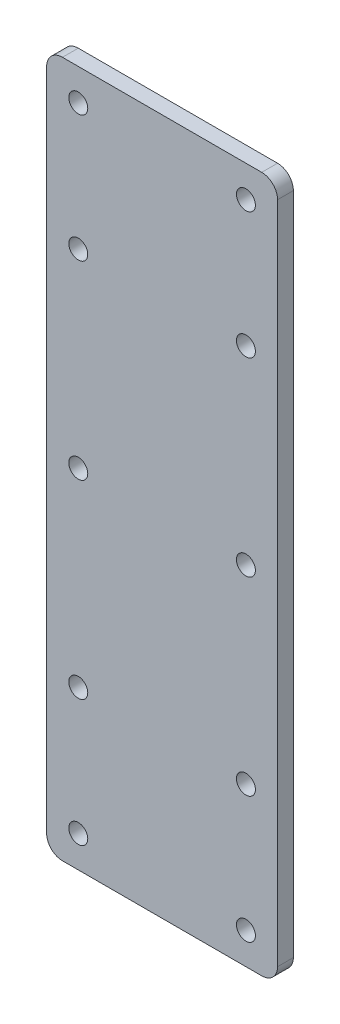
ISO-10303-21;
HEADER;
FILE_DESCRIPTION(('STEP AP214'),'2;1');
FILE_NAME('part.step','',(''),(''),'','','');
FILE_SCHEMA(('AUTOMOTIVE_DESIGN { 1 0 10303 214 1 1 1 1 }'));
ENDSEC;
DATA;
#1=APPLICATION_CONTEXT('core data for automotive mechanical design processes');
#2=APPLICATION_PROTOCOL_DEFINITION('international standard','automotive_design',2000,#1);
#3=PRODUCT_CONTEXT('',#1,'mechanical');
#4=PRODUCT('Part','Part','',(#3));
#5=PRODUCT_RELATED_PRODUCT_CATEGORY('part','',(#4));
#6=PRODUCT_DEFINITION_FORMATION('','',#4);
#7=PRODUCT_DEFINITION_CONTEXT('part definition',#1,'design');
#8=PRODUCT_DEFINITION('design','',#6,#7);
#9=PRODUCT_DEFINITION_SHAPE('','',#8);
#10=(LENGTH_UNIT() NAMED_UNIT(*) SI_UNIT(.MILLI.,.METRE.));
#11=(NAMED_UNIT(*) PLANE_ANGLE_UNIT() SI_UNIT($,.RADIAN.));
#12=(NAMED_UNIT(*) SI_UNIT($,.STERADIAN.) SOLID_ANGLE_UNIT());
#13=UNCERTAINTY_MEASURE_WITH_UNIT(LENGTH_MEASURE(1.E-05),#10,'distance_accuracy_value','');
#14=(GEOMETRIC_REPRESENTATION_CONTEXT(3) GLOBAL_UNCERTAINTY_ASSIGNED_CONTEXT((#13)) GLOBAL_UNIT_ASSIGNED_CONTEXT((#10,
#11,#12)) REPRESENTATION_CONTEXT('',''));
#15=CARTESIAN_POINT('',(0.,0.,0.));
#16=DIRECTION('',(0.,0.,1.));
#17=DIRECTION('',(1.,0.,0.));
#18=AXIS2_PLACEMENT_3D('',#15,#16,#17);
#19=CARTESIAN_POINT('',(4.99999999999988,215.,5.));
#20=DIRECTION('',(0.,0.,-1.));
#21=DIRECTION('',(-1.,0.,0.));
#22=AXIS2_PLACEMENT_3D('',#19,#20,#21);
#23=CYLINDRICAL_SURFACE('',#22,5.00000000000002);
#24=CARTESIAN_POINT('',(4.99999999999988,215.,0.));
#25=DIRECTION('',(0.,0.,1.));
#26=DIRECTION('',(1.,0.,0.));
#27=AXIS2_PLACEMENT_3D('',#24,#25,#26);
#28=CIRCLE('',#27,5.00000000000002);
#29=CARTESIAN_POINT('',(-1.11022302462516E-13,215.,0.));
#30=VERTEX_POINT('',#29);
#31=CARTESIAN_POINT('',(5.,220.,0.));
#32=VERTEX_POINT('',#31);
#33=EDGE_CURVE('E168',#30,#32,#28,.F.);
#34=ORIENTED_EDGE('',*,*,#33,.F.);
#35=DIRECTION('',(0.,0.,-1.));
#36=VECTOR('',#35,1.);
#37=CARTESIAN_POINT('',(-1.11022302462516E-13,215.,5.));
#38=LINE('',#37,#36);
#39=CARTESIAN_POINT('',(-1.11022302462516E-13,215.,5.));
#40=VERTEX_POINT('',#39);
#41=EDGE_CURVE('E11',#40,#30,#38,.T.);
#42=ORIENTED_EDGE('',*,*,#41,.F.);
#43=CARTESIAN_POINT('',(4.99999999999988,215.,5.));
#44=DIRECTION('',(0.,0.,1.));
#45=DIRECTION('',(1.,0.,0.));
#46=AXIS2_PLACEMENT_3D('',#43,#44,#45);
#47=CIRCLE('',#46,5.00000000000002);
#48=CARTESIAN_POINT('',(5.,220.,5.));
#49=VERTEX_POINT('',#48);
#50=EDGE_CURVE('E231',#40,#49,#47,.F.);
#51=ORIENTED_EDGE('',*,*,#50,.T.);
#52=DIRECTION('',(0.,0.,-1.));
#53=VECTOR('',#52,1.);
#54=CARTESIAN_POINT('',(5.,220.,5.));
#55=LINE('',#54,#53);
#56=EDGE_CURVE('E61',#49,#32,#55,.T.);
#57=ORIENTED_EDGE('',*,*,#56,.T.);
#58=EDGE_LOOP('',(#34,#42,#51,#57));
#59=FACE_BOUND('',#58,.T.);
#60=ADVANCED_FACE('F44',(#59),#23,.T.);
#61=CARTESIAN_POINT('',(0.,0.,5.));
#62=DIRECTION('',(-1.,0.,0.));
#63=DIRECTION('',(0.,-1.,0.));
#64=AXIS2_PLACEMENT_3D('',#61,#62,#63);
#65=PLANE('',#64);
#66=DIRECTION('',(0.,1.,0.));
#67=VECTOR('',#66,1.);
#68=CARTESIAN_POINT('',(0.,0.,0.));
#69=LINE('',#68,#67);
#70=CARTESIAN_POINT('',(0.,5.00000000000003,0.));
#71=VERTEX_POINT('',#70);
#72=EDGE_CURVE('E170',#71,#30,#69,.T.);
#73=ORIENTED_EDGE('',*,*,#72,.F.);
#74=DIRECTION('',(0.,0.,-1.));
#75=VECTOR('',#74,1.);
#76=CARTESIAN_POINT('',(0.,5.00000000000003,5.));
#77=LINE('',#76,#75);
#78=CARTESIAN_POINT('',(0.,5.00000000000003,5.));
#79=VERTEX_POINT('',#78);
#80=EDGE_CURVE('E53',#79,#71,#77,.T.);
#81=ORIENTED_EDGE('',*,*,#80,.F.);
#82=DIRECTION('',(0.,1.,0.));
#83=VECTOR('',#82,1.);
#84=CARTESIAN_POINT('',(0.,0.,5.));
#85=LINE('',#84,#83);
#86=EDGE_CURVE('E229',#79,#40,#85,.T.);
#87=ORIENTED_EDGE('',*,*,#86,.T.);
#88=ORIENTED_EDGE('',*,*,#41,.T.);
#89=EDGE_LOOP('',(#73,#81,#87,#88));
#90=FACE_BOUND('',#89,.T.);
#91=ADVANCED_FACE('F218',(#90),#65,.T.);
#92=CARTESIAN_POINT('',(5.,5.,5.));
#93=DIRECTION('',(0.,0.,-1.));
#94=DIRECTION('',(-1.,0.,0.));
#95=AXIS2_PLACEMENT_3D('',#92,#93,#94);
#96=CYLINDRICAL_SURFACE('',#95,5.);
#97=CARTESIAN_POINT('',(5.,5.,0.));
#98=DIRECTION('',(0.,0.,1.));
#99=DIRECTION('',(1.,0.,0.));
#100=AXIS2_PLACEMENT_3D('',#97,#98,#99);
#101=CIRCLE('',#100,5.);
#102=CARTESIAN_POINT('',(5.00000000000003,0.,0.));
#103=VERTEX_POINT('',#102);
#104=EDGE_CURVE('E173',#103,#71,#101,.F.);
#105=ORIENTED_EDGE('',*,*,#104,.F.);
#106=DIRECTION('',(0.,0.,-1.));
#107=VECTOR('',#106,1.);
#108=CARTESIAN_POINT('',(5.00000000000003,0.,5.));
#109=LINE('',#108,#107);
#110=CARTESIAN_POINT('',(5.00000000000003,0.,5.));
#111=VERTEX_POINT('',#110);
#112=EDGE_CURVE('E207',#111,#103,#109,.T.);
#113=ORIENTED_EDGE('',*,*,#112,.F.);
#114=CARTESIAN_POINT('',(5.,5.,5.));
#115=DIRECTION('',(0.,0.,1.));
#116=DIRECTION('',(1.,0.,0.));
#117=AXIS2_PLACEMENT_3D('',#114,#115,#116);
#118=CIRCLE('',#117,5.);
#119=EDGE_CURVE('E214',#111,#79,#118,.F.);
#120=ORIENTED_EDGE('',*,*,#119,.T.);
#121=ORIENTED_EDGE('',*,*,#80,.T.);
#122=EDGE_LOOP('',(#105,#113,#120,#121));
#123=FACE_BOUND('',#122,.T.);
#124=ADVANCED_FACE('F212',(#123),#96,.T.);
#125=CARTESIAN_POINT('',(0.,0.,5.));
#126=DIRECTION('',(0.,1.,0.));
#127=DIRECTION('',(-1.,0.,0.));
#128=AXIS2_PLACEMENT_3D('',#125,#126,#127);
#129=PLANE('',#128);
#130=DIRECTION('',(1.,0.,0.));
#131=VECTOR('',#130,1.);
#132=CARTESIAN_POINT('',(0.,0.,0.));
#133=LINE('',#132,#131);
#134=CARTESIAN_POINT('',(68.,0.,0.));
#135=VERTEX_POINT('',#134);
#136=EDGE_CURVE('E176',#103,#135,#133,.T.);
#137=ORIENTED_EDGE('',*,*,#136,.T.);
#138=DIRECTION('',(0.,0.,-1.));
#139=VECTOR('',#138,1.);
#140=CARTESIAN_POINT('',(68.,0.,5.));
#141=LINE('',#140,#139);
#142=CARTESIAN_POINT('',(68.,0.,5.));
#143=VERTEX_POINT('',#142);
#144=EDGE_CURVE('E204',#143,#135,#141,.T.);
#145=ORIENTED_EDGE('',*,*,#144,.F.);
#146=DIRECTION('',(1.,0.,0.));
#147=VECTOR('',#146,1.);
#148=CARTESIAN_POINT('',(0.,0.,5.));
#149=LINE('',#148,#147);
#150=EDGE_CURVE('E227',#111,#143,#149,.T.);
#151=ORIENTED_EDGE('',*,*,#150,.F.);
#152=ORIENTED_EDGE('',*,*,#112,.T.);
#153=EDGE_LOOP('',(#137,#145,#151,#152));
#154=FACE_BOUND('',#153,.T.);
#155=ADVANCED_FACE('F225',(#154),#129,.F.);
#156=CARTESIAN_POINT('',(68.,5.,5.));
#157=DIRECTION('',(0.,0.,-1.));
#158=DIRECTION('',(-1.,0.,0.));
#159=AXIS2_PLACEMENT_3D('',#156,#157,#158);
#160=CYLINDRICAL_SURFACE('',#159,5.);
#161=CARTESIAN_POINT('',(68.,5.,0.));
#162=DIRECTION('',(0.,0.,1.));
#163=DIRECTION('',(1.,0.,0.));
#164=AXIS2_PLACEMENT_3D('',#161,#162,#163);
#165=CIRCLE('',#164,5.);
#166=CARTESIAN_POINT('',(73.,5.00000000000004,0.));
#167=VERTEX_POINT('',#166);
#168=EDGE_CURVE('E179',#135,#167,#165,.T.);
#169=ORIENTED_EDGE('',*,*,#168,.T.);
#170=DIRECTION('',(0.,0.,-1.));
#171=VECTOR('',#170,1.);
#172=CARTESIAN_POINT('',(73.,5.00000000000004,5.));
#173=LINE('',#172,#171);
#174=CARTESIAN_POINT('',(73.,5.00000000000004,5.));
#175=VERTEX_POINT('',#174);
#176=EDGE_CURVE('E130',#175,#167,#173,.T.);
#177=ORIENTED_EDGE('',*,*,#176,.F.);
#178=CARTESIAN_POINT('',(68.,5.,5.));
#179=DIRECTION('',(0.,0.,1.));
#180=DIRECTION('',(1.,0.,0.));
#181=AXIS2_PLACEMENT_3D('',#178,#179,#180);
#182=CIRCLE('',#181,5.);
#183=EDGE_CURVE('E119',#143,#175,#182,.T.);
#184=ORIENTED_EDGE('',*,*,#183,.F.);
#185=ORIENTED_EDGE('',*,*,#144,.T.);
#186=EDGE_LOOP('',(#169,#177,#184,#185));
#187=FACE_BOUND('',#186,.T.);
#188=ADVANCED_FACE('F345',(#187),#160,.T.);
#189=CARTESIAN_POINT('',(73.,0.,5.));
#190=DIRECTION('',(-1.,0.,0.));
#191=DIRECTION('',(0.,-1.,0.));
#192=AXIS2_PLACEMENT_3D('',#189,#190,#191);
#193=PLANE('',#192);
#194=DIRECTION('',(0.,1.,0.));
#195=VECTOR('',#194,1.);
#196=CARTESIAN_POINT('',(73.,0.,0.));
#197=LINE('',#196,#195);
#198=CARTESIAN_POINT('',(73.,215.,0.));
#199=VERTEX_POINT('',#198);
#200=EDGE_CURVE('E127',#167,#199,#197,.T.);
#201=ORIENTED_EDGE('',*,*,#200,.T.);
#202=DIRECTION('',(0.,0.,-1.));
#203=VECTOR('',#202,1.);
#204=CARTESIAN_POINT('',(73.,215.,5.));
#205=LINE('',#204,#203);
#206=CARTESIAN_POINT('',(73.,215.,5.));
#207=VERTEX_POINT('',#206);
#208=EDGE_CURVE('E125',#207,#199,#205,.T.);
#209=ORIENTED_EDGE('',*,*,#208,.F.);
#210=DIRECTION('',(0.,1.,0.));
#211=VECTOR('',#210,1.);
#212=CARTESIAN_POINT('',(73.,0.,5.));
#213=LINE('',#212,#211);
#214=EDGE_CURVE('E111',#175,#207,#213,.T.);
#215=ORIENTED_EDGE('',*,*,#214,.F.);
#216=ORIENTED_EDGE('',*,*,#176,.T.);
#217=EDGE_LOOP('',(#201,#209,#215,#216));
#218=FACE_BOUND('',#217,.T.);
#219=ADVANCED_FACE('F126',(#218),#193,.F.);
#220=CARTESIAN_POINT('',(68.,215.,5.));
#221=DIRECTION('',(0.,0.,-1.));
#222=DIRECTION('',(-1.,0.,0.));
#223=AXIS2_PLACEMENT_3D('',#220,#221,#222);
#224=CYLINDRICAL_SURFACE('',#223,5.00000000000002);
#225=CARTESIAN_POINT('',(68.,215.,0.));
#226=DIRECTION('',(0.,0.,1.));
#227=DIRECTION('',(1.,0.,0.));
#228=AXIS2_PLACEMENT_3D('',#225,#226,#227);
#229=CIRCLE('',#228,5.00000000000002);
#230=CARTESIAN_POINT('',(67.9999999999999,220.,0.));
#231=VERTEX_POINT('',#230);
#232=EDGE_CURVE('E183',#231,#199,#229,.F.);
#233=ORIENTED_EDGE('',*,*,#232,.F.);
#234=DIRECTION('',(0.,0.,-1.));
#235=VECTOR('',#234,1.);
#236=CARTESIAN_POINT('',(67.9999999999999,220.,5.));
#237=LINE('',#236,#235);
#238=CARTESIAN_POINT('',(67.9999999999999,220.,5.));
#239=VERTEX_POINT('',#238);
#240=EDGE_CURVE('E86',#239,#231,#237,.T.);
#241=ORIENTED_EDGE('',*,*,#240,.F.);
#242=CARTESIAN_POINT('',(68.,215.,5.));
#243=DIRECTION('',(0.,0.,1.));
#244=DIRECTION('',(1.,0.,0.));
#245=AXIS2_PLACEMENT_3D('',#242,#243,#244);
#246=CIRCLE('',#245,5.00000000000002);
#247=EDGE_CURVE('E117',#239,#207,#246,.F.);
#248=ORIENTED_EDGE('',*,*,#247,.T.);
#249=ORIENTED_EDGE('',*,*,#208,.T.);
#250=EDGE_LOOP('',(#233,#241,#248,#249));
#251=FACE_BOUND('',#250,.T.);
#252=ADVANCED_FACE('F132',(#251),#224,.T.);
#253=CARTESIAN_POINT('',(9.99999999999999,50.,5.));
#254=DIRECTION('',(0.,0.,-1.));
#255=DIRECTION('',(-1.,0.,0.));
#256=AXIS2_PLACEMENT_3D('',#253,#254,#255);
#257=CYLINDRICAL_SURFACE('',#256,3.);
#258=CARTESIAN_POINT('',(9.99999999999999,50.,5.));
#259=DIRECTION('',(0.,0.,1.));
#260=DIRECTION('',(1.,0.,0.));
#261=AXIS2_PLACEMENT_3D('',#258,#259,#260);
#262=CIRCLE('',#261,3.);
#263=CARTESIAN_POINT('',(13.,50.,5.));
#264=VERTEX_POINT('',#263);
#265=EDGE_CURVE('E144',#264,#264,#262,.T.);
#266=ORIENTED_EDGE('',*,*,#265,.T.);
#267=EDGE_LOOP('',(#266));
#268=FACE_BOUND('',#267,.T.);
#269=CARTESIAN_POINT('',(9.99999999999999,50.,0.));
#270=DIRECTION('',(0.,0.,1.));
#271=DIRECTION('',(1.,0.,0.));
#272=AXIS2_PLACEMENT_3D('',#269,#270,#271);
#273=CIRCLE('',#272,3.);
#274=CARTESIAN_POINT('',(13.,50.,0.));
#275=VERTEX_POINT('',#274);
#276=EDGE_CURVE('E194',#275,#275,#273,.T.);
#277=ORIENTED_EDGE('',*,*,#276,.F.);
#278=EDGE_LOOP('',(#277));
#279=FACE_BOUND('',#278,.T.);
#280=ADVANCED_FACE('F327',(#268,#279),#257,.F.);
#281=CARTESIAN_POINT('',(9.99999999999998,110.,5.));
#282=DIRECTION('',(0.,0.,-1.));
#283=DIRECTION('',(-1.,0.,0.));
#284=AXIS2_PLACEMENT_3D('',#281,#282,#283);
#285=CYLINDRICAL_SURFACE('',#284,3.);
#286=CARTESIAN_POINT('',(9.99999999999998,110.,5.));
#287=DIRECTION('',(0.,0.,1.));
#288=DIRECTION('',(1.,0.,0.));
#289=AXIS2_PLACEMENT_3D('',#286,#287,#288);
#290=CIRCLE('',#289,3.);
#291=CARTESIAN_POINT('',(13.,110.,5.));
#292=VERTEX_POINT('',#291);
#293=EDGE_CURVE('E141',#292,#292,#290,.T.);
#294=ORIENTED_EDGE('',*,*,#293,.T.);
#295=EDGE_LOOP('',(#294));
#296=FACE_BOUND('',#295,.T.);
#297=CARTESIAN_POINT('',(9.99999999999998,110.,0.));
#298=DIRECTION('',(0.,0.,1.));
#299=DIRECTION('',(1.,0.,0.));
#300=AXIS2_PLACEMENT_3D('',#297,#298,#299);
#301=CIRCLE('',#300,3.);
#302=CARTESIAN_POINT('',(13.,110.,0.));
#303=VERTEX_POINT('',#302);
#304=EDGE_CURVE('E191',#303,#303,#301,.T.);
#305=ORIENTED_EDGE('',*,*,#304,.F.);
#306=EDGE_LOOP('',(#305));
#307=FACE_BOUND('',#306,.T.);
#308=ADVANCED_FACE('F330',(#296,#307),#285,.F.);
#309=CARTESIAN_POINT('',(63.,110.,5.));
#310=DIRECTION('',(0.,0.,-1.));
#311=DIRECTION('',(-1.,0.,0.));
#312=AXIS2_PLACEMENT_3D('',#309,#310,#311);
#313=CYLINDRICAL_SURFACE('',#312,3.00000000000001);
#314=CARTESIAN_POINT('',(63.,110.,5.));
#315=DIRECTION('',(0.,0.,1.));
#316=DIRECTION('',(1.,0.,0.));
#317=AXIS2_PLACEMENT_3D('',#314,#315,#316);
#318=CIRCLE('',#317,3.00000000000001);
#319=CARTESIAN_POINT('',(66.,110.,5.));
#320=VERTEX_POINT('',#319);
#321=EDGE_CURVE('E135',#320,#320,#318,.T.);
#322=ORIENTED_EDGE('',*,*,#321,.T.);
#323=EDGE_LOOP('',(#322));
#324=FACE_BOUND('',#323,.T.);
#325=CARTESIAN_POINT('',(63.,110.,0.));
#326=DIRECTION('',(0.,0.,1.));
#327=DIRECTION('',(1.,0.,0.));
#328=AXIS2_PLACEMENT_3D('',#325,#326,#327);
#329=CIRCLE('',#328,3.00000000000001);
#330=CARTESIAN_POINT('',(66.,110.,0.));
#331=VERTEX_POINT('',#330);
#332=EDGE_CURVE('E188',#331,#331,#329,.T.);
#333=ORIENTED_EDGE('',*,*,#332,.F.);
#334=EDGE_LOOP('',(#333));
#335=FACE_BOUND('',#334,.T.);
#336=ADVANCED_FACE('F334',(#324,#335),#313,.F.);
#337=CARTESIAN_POINT('',(0.,220.,5.));
#338=DIRECTION('',(0.,1.,0.));
#339=DIRECTION('',(-1.,0.,0.));
#340=AXIS2_PLACEMENT_3D('',#337,#338,#339);
#341=PLANE('',#340);
#342=DIRECTION('',(1.,0.,0.));
#343=VECTOR('',#342,1.);
#344=CARTESIAN_POINT('',(0.,220.,0.));
#345=LINE('',#344,#343);
#346=EDGE_CURVE('E185',#32,#231,#345,.T.);
#347=ORIENTED_EDGE('',*,*,#346,.F.);
#348=ORIENTED_EDGE('',*,*,#56,.F.);
#349=DIRECTION('',(1.,0.,0.));
#350=VECTOR('',#349,1.);
#351=CARTESIAN_POINT('',(0.,220.,5.));
#352=LINE('',#351,#350);
#353=EDGE_CURVE('E133',#49,#239,#352,.T.);
#354=ORIENTED_EDGE('',*,*,#353,.T.);
#355=ORIENTED_EDGE('',*,*,#240,.T.);
#356=EDGE_LOOP('',(#347,#348,#354,#355));
#357=FACE_BOUND('',#356,.T.);
#358=ADVANCED_FACE('F273',(#357),#341,.T.);
#359=CARTESIAN_POINT('',(63.,170.,5.));
#360=DIRECTION('',(0.,0.,-1.));
#361=DIRECTION('',(-1.,0.,0.));
#362=AXIS2_PLACEMENT_3D('',#359,#360,#361);
#363=CYLINDRICAL_SURFACE('',#362,3.00000000000001);
#364=CARTESIAN_POINT('',(63.,170.,5.));
#365=DIRECTION('',(0.,0.,1.));
#366=DIRECTION('',(1.,0.,0.));
#367=AXIS2_PLACEMENT_3D('',#364,#365,#366);
#368=CIRCLE('',#367,3.00000000000001);
#369=CARTESIAN_POINT('',(66.,170.,5.));
#370=VERTEX_POINT('',#369);
#371=EDGE_CURVE('E235',#370,#370,#368,.T.);
#372=ORIENTED_EDGE('',*,*,#371,.T.);
#373=EDGE_LOOP('',(#372));
#374=FACE_BOUND('',#373,.T.);
#375=CARTESIAN_POINT('',(63.,170.,0.));
#376=DIRECTION('',(0.,0.,1.));
#377=DIRECTION('',(1.,0.,0.));
#378=AXIS2_PLACEMENT_3D('',#375,#376,#377);
#379=CIRCLE('',#378,3.00000000000001);
#380=CARTESIAN_POINT('',(66.,170.,0.));
#381=VERTEX_POINT('',#380);
#382=EDGE_CURVE('E165',#381,#381,#379,.T.);
#383=ORIENTED_EDGE('',*,*,#382,.F.);
#384=EDGE_LOOP('',(#383));
#385=FACE_BOUND('',#384,.T.);
#386=ADVANCED_FACE('F269',(#374,#385),#363,.F.);
#387=CARTESIAN_POINT('',(62.9999999999999,210.,5.));
#388=DIRECTION('',(0.,0.,-1.));
#389=DIRECTION('',(-1.,0.,0.));
#390=AXIS2_PLACEMENT_3D('',#387,#388,#389);
#391=CYLINDRICAL_SURFACE('',#390,3.00000000000001);
#392=CARTESIAN_POINT('',(62.9999999999999,210.,5.));
#393=DIRECTION('',(0.,0.,1.));
#394=DIRECTION('',(1.,0.,0.));
#395=AXIS2_PLACEMENT_3D('',#392,#393,#394);
#396=CIRCLE('',#395,3.00000000000001);
#397=CARTESIAN_POINT('',(65.9999999999999,210.,5.));
#398=VERTEX_POINT('',#397);
#399=EDGE_CURVE('E238',#398,#398,#396,.T.);
#400=ORIENTED_EDGE('',*,*,#399,.T.);
#401=EDGE_LOOP('',(#400));
#402=FACE_BOUND('',#401,.T.);
#403=CARTESIAN_POINT('',(62.9999999999999,210.,0.));
#404=DIRECTION('',(0.,0.,1.));
#405=DIRECTION('',(1.,0.,0.));
#406=AXIS2_PLACEMENT_3D('',#403,#404,#405);
#407=CIRCLE('',#406,3.00000000000001);
#408=CARTESIAN_POINT('',(65.9999999999999,210.,0.));
#409=VERTEX_POINT('',#408);
#410=EDGE_CURVE('E162',#409,#409,#407,.T.);
#411=ORIENTED_EDGE('',*,*,#410,.F.);
#412=EDGE_LOOP('',(#411));
#413=FACE_BOUND('',#412,.T.);
#414=ADVANCED_FACE('F272',(#402,#413),#391,.F.);
#415=CARTESIAN_POINT('',(9.99999999999996,170.,5.));
#416=DIRECTION('',(0.,0.,-1.));
#417=DIRECTION('',(-1.,0.,0.));
#418=AXIS2_PLACEMENT_3D('',#415,#416,#417);
#419=CYLINDRICAL_SURFACE('',#418,3.);
#420=CARTESIAN_POINT('',(9.99999999999996,170.,5.));
#421=DIRECTION('',(0.,0.,1.));
#422=DIRECTION('',(1.,0.,0.));
#423=AXIS2_PLACEMENT_3D('',#420,#421,#422);
#424=CIRCLE('',#423,3.);
#425=CARTESIAN_POINT('',(13.,170.,5.));
#426=VERTEX_POINT('',#425);
#427=EDGE_CURVE('E241',#426,#426,#424,.T.);
#428=ORIENTED_EDGE('',*,*,#427,.T.);
#429=EDGE_LOOP('',(#428));
#430=FACE_BOUND('',#429,.T.);
#431=CARTESIAN_POINT('',(9.99999999999996,170.,0.));
#432=DIRECTION('',(0.,0.,1.));
#433=DIRECTION('',(1.,0.,0.));
#434=AXIS2_PLACEMENT_3D('',#431,#432,#433);
#435=CIRCLE('',#434,3.);
#436=CARTESIAN_POINT('',(13.,170.,0.));
#437=VERTEX_POINT('',#436);
#438=EDGE_CURVE('E159',#437,#437,#435,.T.);
#439=ORIENTED_EDGE('',*,*,#438,.F.);
#440=EDGE_LOOP('',(#439));
#441=FACE_BOUND('',#440,.T.);
#442=ADVANCED_FACE('F294',(#430,#441),#419,.F.);
#443=CARTESIAN_POINT('',(63.,50.,5.));
#444=DIRECTION('',(0.,0.,-1.));
#445=DIRECTION('',(-1.,0.,0.));
#446=AXIS2_PLACEMENT_3D('',#443,#444,#445);
#447=CYLINDRICAL_SURFACE('',#446,3.00000000000001);
#448=CARTESIAN_POINT('',(63.,50.,5.));
#449=DIRECTION('',(0.,0.,1.));
#450=DIRECTION('',(1.,0.,0.));
#451=AXIS2_PLACEMENT_3D('',#448,#449,#450);
#452=CIRCLE('',#451,3.00000000000001);
#453=CARTESIAN_POINT('',(66.,50.,5.));
#454=VERTEX_POINT('',#453);
#455=EDGE_CURVE('E244',#454,#454,#452,.T.);
#456=ORIENTED_EDGE('',*,*,#455,.T.);
#457=EDGE_LOOP('',(#456));
#458=FACE_BOUND('',#457,.T.);
#459=CARTESIAN_POINT('',(63.,50.,0.));
#460=DIRECTION('',(0.,0.,1.));
#461=DIRECTION('',(1.,0.,0.));
#462=AXIS2_PLACEMENT_3D('',#459,#460,#461);
#463=CIRCLE('',#462,3.00000000000001);
#464=CARTESIAN_POINT('',(66.,50.,0.));
#465=VERTEX_POINT('',#464);
#466=EDGE_CURVE('E156',#465,#465,#463,.T.);
#467=ORIENTED_EDGE('',*,*,#466,.F.);
#468=EDGE_LOOP('',(#467));
#469=FACE_BOUND('',#468,.T.);
#470=ADVANCED_FACE('F298',(#458,#469),#447,.F.);
#471=CARTESIAN_POINT('',(9.99999999999999,10.,5.));
#472=DIRECTION('',(0.,0.,-1.));
#473=DIRECTION('',(-1.,0.,0.));
#474=AXIS2_PLACEMENT_3D('',#471,#472,#473);
#475=CYLINDRICAL_SURFACE('',#474,3.);
#476=CARTESIAN_POINT('',(9.99999999999999,10.,5.));
#477=DIRECTION('',(0.,0.,1.));
#478=DIRECTION('',(1.,0.,0.));
#479=AXIS2_PLACEMENT_3D('',#476,#477,#478);
#480=CIRCLE('',#479,3.);
#481=CARTESIAN_POINT('',(13.,10.,5.));
#482=VERTEX_POINT('',#481);
#483=EDGE_CURVE('E247',#482,#482,#480,.T.);
#484=ORIENTED_EDGE('',*,*,#483,.T.);
#485=EDGE_LOOP('',(#484));
#486=FACE_BOUND('',#485,.T.);
#487=CARTESIAN_POINT('',(9.99999999999999,10.,0.));
#488=DIRECTION('',(0.,0.,1.));
#489=DIRECTION('',(1.,0.,0.));
#490=AXIS2_PLACEMENT_3D('',#487,#488,#489);
#491=CIRCLE('',#490,3.);
#492=CARTESIAN_POINT('',(13.,10.,0.));
#493=VERTEX_POINT('',#492);
#494=EDGE_CURVE('E153',#493,#493,#491,.T.);
#495=ORIENTED_EDGE('',*,*,#494,.F.);
#496=EDGE_LOOP('',(#495));
#497=FACE_BOUND('',#496,.T.);
#498=ADVANCED_FACE('F301',(#486,#497),#475,.F.);
#499=CARTESIAN_POINT('',(63.,10.,5.));
#500=DIRECTION('',(0.,0.,-1.));
#501=DIRECTION('',(-1.,0.,0.));
#502=AXIS2_PLACEMENT_3D('',#499,#500,#501);
#503=CYLINDRICAL_SURFACE('',#502,3.00000000000001);
#504=CARTESIAN_POINT('',(63.,10.,5.));
#505=DIRECTION('',(0.,0.,1.));
#506=DIRECTION('',(1.,0.,0.));
#507=AXIS2_PLACEMENT_3D('',#504,#505,#506);
#508=CIRCLE('',#507,3.00000000000001);
#509=CARTESIAN_POINT('',(66.,10.,5.));
#510=VERTEX_POINT('',#509);
#511=EDGE_CURVE('E200',#510,#510,#508,.T.);
#512=ORIENTED_EDGE('',*,*,#511,.T.);
#513=EDGE_LOOP('',(#512));
#514=FACE_BOUND('',#513,.T.);
#515=CARTESIAN_POINT('',(63.,10.,0.));
#516=DIRECTION('',(0.,0.,1.));
#517=DIRECTION('',(1.,0.,0.));
#518=AXIS2_PLACEMENT_3D('',#515,#516,#517);
#519=CIRCLE('',#518,3.00000000000001);
#520=CARTESIAN_POINT('',(66.,10.,0.));
#521=VERTEX_POINT('',#520);
#522=EDGE_CURVE('E150',#521,#521,#519,.T.);
#523=ORIENTED_EDGE('',*,*,#522,.F.);
#524=EDGE_LOOP('',(#523));
#525=FACE_BOUND('',#524,.T.);
#526=ADVANCED_FACE('F46',(#514,#525),#503,.F.);
#527=CARTESIAN_POINT('',(9.99999999999996,210.,5.));
#528=DIRECTION('',(0.,0.,-1.));
#529=DIRECTION('',(-1.,0.,0.));
#530=AXIS2_PLACEMENT_3D('',#527,#528,#529);
#531=CYLINDRICAL_SURFACE('',#530,3.);
#532=CARTESIAN_POINT('',(9.99999999999996,210.,5.));
#533=DIRECTION('',(0.,0.,1.));
#534=DIRECTION('',(1.,0.,0.));
#535=AXIS2_PLACEMENT_3D('',#532,#533,#534);
#536=CIRCLE('',#535,3.);
#537=CARTESIAN_POINT('',(13.,210.,5.));
#538=VERTEX_POINT('',#537);
#539=EDGE_CURVE('E147',#538,#538,#536,.T.);
#540=ORIENTED_EDGE('',*,*,#539,.T.);
#541=EDGE_LOOP('',(#540));
#542=FACE_BOUND('',#541,.T.);
#543=CARTESIAN_POINT('',(9.99999999999996,210.,0.));
#544=DIRECTION('',(0.,0.,1.));
#545=DIRECTION('',(1.,0.,0.));
#546=AXIS2_PLACEMENT_3D('',#543,#544,#545);
#547=CIRCLE('',#546,3.);
#548=CARTESIAN_POINT('',(13.,210.,0.));
#549=VERTEX_POINT('',#548);
#550=EDGE_CURVE('E197',#549,#549,#547,.T.);
#551=ORIENTED_EDGE('',*,*,#550,.F.);
#552=EDGE_LOOP('',(#551));
#553=FACE_BOUND('',#552,.T.);
#554=ADVANCED_FACE('F257',(#542,#553),#531,.F.);
#555=CARTESIAN_POINT('',(0.,0.,5.));
#556=DIRECTION('',(0.,0.,1.));
#557=DIRECTION('',(1.,0.,0.));
#558=AXIS2_PLACEMENT_3D('',#555,#556,#557);
#559=PLANE('',#558);
#560=ORIENTED_EDGE('',*,*,#511,.F.);
#561=EDGE_LOOP('',(#560));
#562=FACE_BOUND('',#561,.T.);
#563=ORIENTED_EDGE('',*,*,#483,.F.);
#564=EDGE_LOOP('',(#563));
#565=FACE_BOUND('',#564,.T.);
#566=ORIENTED_EDGE('',*,*,#455,.F.);
#567=EDGE_LOOP('',(#566));
#568=FACE_BOUND('',#567,.T.);
#569=ORIENTED_EDGE('',*,*,#427,.F.);
#570=EDGE_LOOP('',(#569));
#571=FACE_BOUND('',#570,.T.);
#572=ORIENTED_EDGE('',*,*,#399,.F.);
#573=EDGE_LOOP('',(#572));
#574=FACE_BOUND('',#573,.T.);
#575=ORIENTED_EDGE('',*,*,#371,.F.);
#576=EDGE_LOOP('',(#575));
#577=FACE_BOUND('',#576,.T.);
#578=ORIENTED_EDGE('',*,*,#50,.F.);
#579=ORIENTED_EDGE('',*,*,#86,.F.);
#580=ORIENTED_EDGE('',*,*,#119,.F.);
#581=ORIENTED_EDGE('',*,*,#150,.T.);
#582=ORIENTED_EDGE('',*,*,#183,.T.);
#583=ORIENTED_EDGE('',*,*,#214,.T.);
#584=ORIENTED_EDGE('',*,*,#247,.F.);
#585=ORIENTED_EDGE('',*,*,#353,.F.);
#586=EDGE_LOOP('',(#578,#579,#580,#581,#582,#583,#584,#585));
#587=FACE_BOUND('',#586,.T.);
#588=ORIENTED_EDGE('',*,*,#321,.F.);
#589=EDGE_LOOP('',(#588));
#590=FACE_BOUND('',#589,.T.);
#591=ORIENTED_EDGE('',*,*,#293,.F.);
#592=EDGE_LOOP('',(#591));
#593=FACE_BOUND('',#592,.T.);
#594=ORIENTED_EDGE('',*,*,#265,.F.);
#595=EDGE_LOOP('',(#594));
#596=FACE_BOUND('',#595,.T.);
#597=ORIENTED_EDGE('',*,*,#539,.F.);
#598=EDGE_LOOP('',(#597));
#599=FACE_BOUND('',#598,.T.);
#600=ADVANCED_FACE('F113',(#562,#565,#568,#571,#574,#577,#587,#590,#593,#596,#599),#559,.T.);
#601=CARTESIAN_POINT('',(0.,0.,0.));
#602=DIRECTION('',(0.,0.,1.));
#603=DIRECTION('',(1.,0.,0.));
#604=AXIS2_PLACEMENT_3D('',#601,#602,#603);
#605=PLANE('',#604);
#606=ORIENTED_EDGE('',*,*,#522,.T.);
#607=EDGE_LOOP('',(#606));
#608=FACE_BOUND('',#607,.T.);
#609=ORIENTED_EDGE('',*,*,#494,.T.);
#610=EDGE_LOOP('',(#609));
#611=FACE_BOUND('',#610,.T.);
#612=ORIENTED_EDGE('',*,*,#466,.T.);
#613=EDGE_LOOP('',(#612));
#614=FACE_BOUND('',#613,.T.);
#615=ORIENTED_EDGE('',*,*,#438,.T.);
#616=EDGE_LOOP('',(#615));
#617=FACE_BOUND('',#616,.T.);
#618=ORIENTED_EDGE('',*,*,#410,.T.);
#619=EDGE_LOOP('',(#618));
#620=FACE_BOUND('',#619,.T.);
#621=ORIENTED_EDGE('',*,*,#382,.T.);
#622=EDGE_LOOP('',(#621));
#623=FACE_BOUND('',#622,.T.);
#624=ORIENTED_EDGE('',*,*,#33,.T.);
#625=ORIENTED_EDGE('',*,*,#346,.T.);
#626=ORIENTED_EDGE('',*,*,#232,.T.);
#627=ORIENTED_EDGE('',*,*,#200,.F.);
#628=ORIENTED_EDGE('',*,*,#168,.F.);
#629=ORIENTED_EDGE('',*,*,#136,.F.);
#630=ORIENTED_EDGE('',*,*,#104,.T.);
#631=ORIENTED_EDGE('',*,*,#72,.T.);
#632=EDGE_LOOP('',(#624,#625,#626,#627,#628,#629,#630,#631));
#633=FACE_BOUND('',#632,.T.);
#634=ORIENTED_EDGE('',*,*,#332,.T.);
#635=EDGE_LOOP('',(#634));
#636=FACE_BOUND('',#635,.T.);
#637=ORIENTED_EDGE('',*,*,#304,.T.);
#638=EDGE_LOOP('',(#637));
#639=FACE_BOUND('',#638,.T.);
#640=ORIENTED_EDGE('',*,*,#276,.T.);
#641=EDGE_LOOP('',(#640));
#642=FACE_BOUND('',#641,.T.);
#643=ORIENTED_EDGE('',*,*,#550,.T.);
#644=EDGE_LOOP('',(#643));
#645=FACE_BOUND('',#644,.T.);
#646=ADVANCED_FACE('F221',(#608,#611,#614,#617,#620,#623,#633,#636,#639,#642,#645),#605,.F.);
#647=CLOSED_SHELL('',(#60,#91,#124,#155,#188,#219,#252,#280,#308,#336,#358,#386,#414,#442,#470,
#498,#526,#554,#600,#646));
#648=MANIFOLD_SOLID_BREP('B2',#647);
#649=ADVANCED_BREP_SHAPE_REPRESENTATION('',(#18,#648),#14);
#650=SHAPE_DEFINITION_REPRESENTATION(#9,#649);
ENDSEC;
END-ISO-10303-21;
